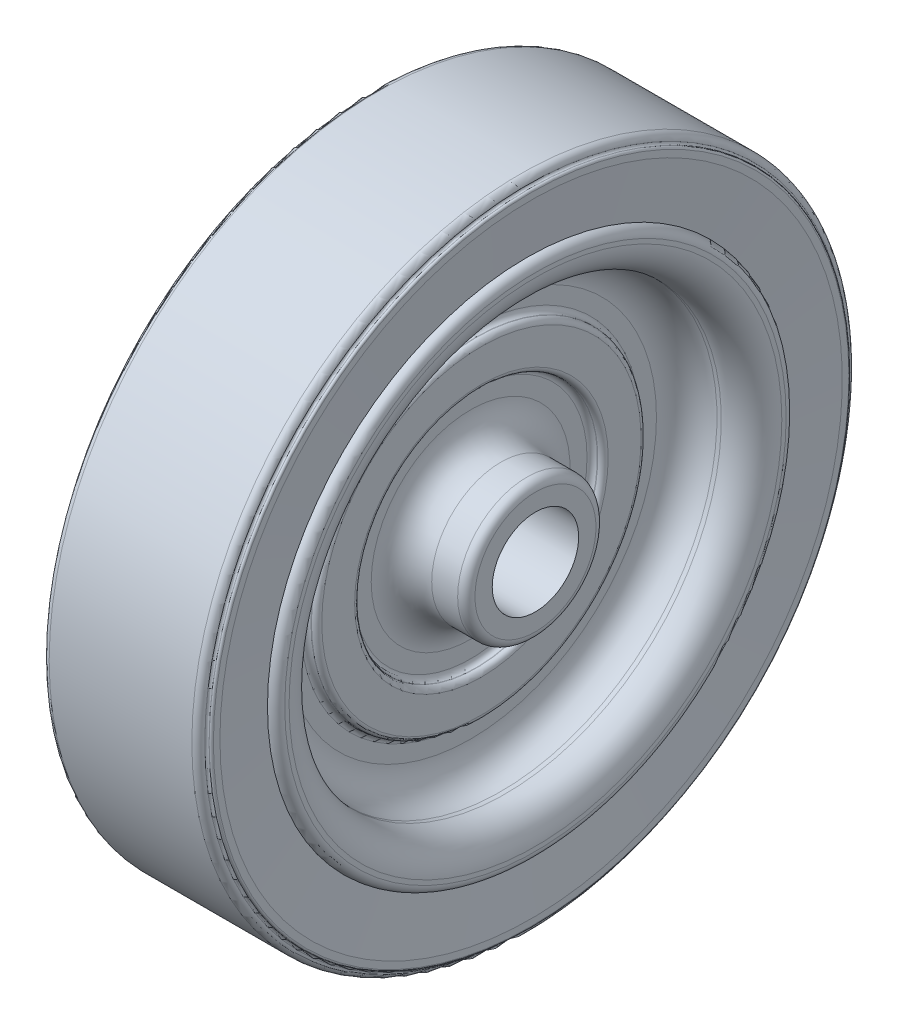
ISO-10303-21;
HEADER;
FILE_DESCRIPTION(('STEP AP214'),'2;1');
FILE_NAME('part.step','',(''),(''),'','','');
FILE_SCHEMA(('AUTOMOTIVE_DESIGN { 1 0 10303 214 1 1 1 1 }'));
ENDSEC;
DATA;
#1=APPLICATION_CONTEXT('core data for automotive mechanical design processes');
#2=APPLICATION_PROTOCOL_DEFINITION('international standard','automotive_design',2000,#1);
#3=PRODUCT_CONTEXT('',#1,'mechanical');
#4=PRODUCT('Part','Part','',(#3));
#5=PRODUCT_RELATED_PRODUCT_CATEGORY('part','',(#4));
#6=PRODUCT_DEFINITION_FORMATION('','',#4);
#7=PRODUCT_DEFINITION_CONTEXT('part definition',#1,'design');
#8=PRODUCT_DEFINITION('design','',#6,#7);
#9=PRODUCT_DEFINITION_SHAPE('','',#8);
#10=(LENGTH_UNIT() NAMED_UNIT(*) SI_UNIT(.MILLI.,.METRE.));
#11=(NAMED_UNIT(*) PLANE_ANGLE_UNIT() SI_UNIT($,.RADIAN.));
#12=(NAMED_UNIT(*) SI_UNIT($,.STERADIAN.) SOLID_ANGLE_UNIT());
#13=UNCERTAINTY_MEASURE_WITH_UNIT(LENGTH_MEASURE(1.E-05),#10,'distance_accuracy_value','');
#14=(GEOMETRIC_REPRESENTATION_CONTEXT(3) GLOBAL_UNCERTAINTY_ASSIGNED_CONTEXT((#13)) GLOBAL_UNIT_ASSIGNED_CONTEXT((#10,
#11,#12)) REPRESENTATION_CONTEXT('',''));
#15=CARTESIAN_POINT('',(0.,0.,0.));
#16=DIRECTION('',(0.,0.,1.));
#17=DIRECTION('',(1.,0.,0.));
#18=AXIS2_PLACEMENT_3D('',#15,#16,#17);
#19=CARTESIAN_POINT('',(18.7927608161497,14.,0.));
#20=DIRECTION('',(-1.,0.,0.));
#21=DIRECTION('',(0.,0.,1.));
#22=AXIS2_PLACEMENT_3D('',#19,#20,#21);
#23=PLANE('',#22);
#24=CARTESIAN_POINT('',(18.7927608161497,0.,0.));
#25=DIRECTION('',(-1.,0.,0.));
#26=DIRECTION('',(0.,0.,1.));
#27=AXIS2_PLACEMENT_3D('',#24,#25,#26);
#28=CIRCLE('',#27,14.);
#29=CARTESIAN_POINT('',(18.7927608161497,0.,14.));
#30=VERTEX_POINT('',#29);
#31=EDGE_CURVE('E10',#30,#30,#28,.T.);
#32=ORIENTED_EDGE('',*,*,#31,.F.);
#33=EDGE_LOOP('',(#32));
#34=FACE_BOUND('',#33,.T.);
#35=CARTESIAN_POINT('',(18.7927608161497,0.,0.));
#36=DIRECTION('',(-1.,0.,0.));
#37=DIRECTION('',(0.,0.,1.));
#38=AXIS2_PLACEMENT_3D('',#35,#36,#37);
#39=CIRCLE('',#38,10.);
#40=CARTESIAN_POINT('',(18.7927608161497,0.,10.));
#41=VERTEX_POINT('',#40);
#42=EDGE_CURVE('E147',#41,#41,#39,.T.);
#43=ORIENTED_EDGE('',*,*,#42,.T.);
#44=EDGE_LOOP('',(#43));
#45=FACE_BOUND('',#44,.T.);
#46=ADVANCED_FACE('F32',(#34,#45),#23,.F.);
#47=CARTESIAN_POINT('',(16.7927608161497,0.,0.));
#48=DIRECTION('',(-1.,0.,0.));
#49=DIRECTION('',(0.,0.,1.));
#50=AXIS2_PLACEMENT_3D('',#47,#48,#49);
#51=TOROIDAL_SURFACE('',#50,14.,2.);
#52=CARTESIAN_POINT('',(16.7927608161496,0.,0.));
#53=DIRECTION('',(-1.,0.,0.));
#54=DIRECTION('',(0.,0.,1.));
#55=AXIS2_PLACEMENT_3D('',#52,#53,#54);
#56=CIRCLE('',#55,16.);
#57=CARTESIAN_POINT('',(16.7927608161496,0.,16.));
#58=VERTEX_POINT('',#57);
#59=EDGE_CURVE('E38',#58,#58,#56,.T.);
#60=ORIENTED_EDGE('',*,*,#59,.F.);
#61=EDGE_LOOP('',(#60));
#62=FACE_BOUND('',#61,.T.);
#63=ORIENTED_EDGE('',*,*,#31,.T.);
#64=EDGE_LOOP('',(#63));
#65=FACE_BOUND('',#64,.T.);
#66=ADVANCED_FACE('F297',(#62,#65),#51,.T.);
#67=CARTESIAN_POINT('',(-29.5072725671877,0.,0.));
#68=DIRECTION('',(-1.,0.,0.));
#69=DIRECTION('',(0.,0.,1.));
#70=AXIS2_PLACEMENT_3D('',#67,#68,#69);
#71=CYLINDRICAL_SURFACE('',#70,16.);
#72=CARTESIAN_POINT('',(10.7927608161497,0.,0.));
#73=DIRECTION('',(-1.,0.,0.));
#74=DIRECTION('',(0.,0.,1.));
#75=AXIS2_PLACEMENT_3D('',#72,#73,#74);
#76=CIRCLE('',#75,16.);
#77=CARTESIAN_POINT('',(10.7927608161497,0.,16.));
#78=VERTEX_POINT('',#77);
#79=EDGE_CURVE('E42',#78,#78,#76,.T.);
#80=ORIENTED_EDGE('',*,*,#79,.F.);
#81=EDGE_LOOP('',(#80));
#82=FACE_BOUND('',#81,.T.);
#83=ORIENTED_EDGE('',*,*,#59,.T.);
#84=EDGE_LOOP('',(#83));
#85=FACE_BOUND('',#84,.T.);
#86=ADVANCED_FACE('F292',(#82,#85),#71,.T.);
#87=CARTESIAN_POINT('',(10.7927608161497,0.,0.));
#88=DIRECTION('',(-1.,0.,0.));
#89=DIRECTION('',(0.,0.,1.));
#90=AXIS2_PLACEMENT_3D('',#87,#88,#89);
#91=TOROIDAL_SURFACE('',#90,23.,7.);
#92=CARTESIAN_POINT('',(3.79276081614965,0.,0.));
#93=DIRECTION('',(-1.,0.,0.));
#94=DIRECTION('',(0.,0.,1.));
#95=AXIS2_PLACEMENT_3D('',#92,#93,#94);
#96=CIRCLE('',#95,23.);
#97=CARTESIAN_POINT('',(3.79276081614965,0.,23.));
#98=VERTEX_POINT('',#97);
#99=EDGE_CURVE('E46',#98,#98,#96,.T.);
#100=ORIENTED_EDGE('',*,*,#99,.F.);
#101=EDGE_LOOP('',(#100));
#102=FACE_BOUND('',#101,.T.);
#103=ORIENTED_EDGE('',*,*,#79,.T.);
#104=EDGE_LOOP('',(#103));
#105=FACE_BOUND('',#104,.T.);
#106=ADVANCED_FACE('F286',(#102,#105),#91,.F.);
#107=CARTESIAN_POINT('',(3.79276081614965,23.,0.));
#108=DIRECTION('',(-1.,0.,0.));
#109=DIRECTION('',(0.,0.,1.));
#110=AXIS2_PLACEMENT_3D('',#107,#108,#109);
#111=PLANE('',#110);
#112=CARTESIAN_POINT('',(3.79276081614965,0.,0.));
#113=DIRECTION('',(-1.,0.,0.));
#114=DIRECTION('',(0.,0.,1.));
#115=AXIS2_PLACEMENT_3D('',#112,#113,#114);
#116=CIRCLE('',#115,26.935922425169);
#117=CARTESIAN_POINT('',(3.79276081614965,0.,26.935922425169));
#118=VERTEX_POINT('',#117);
#119=EDGE_CURVE('E51',#118,#118,#116,.T.);
#120=ORIENTED_EDGE('',*,*,#119,.F.);
#121=EDGE_LOOP('',(#120));
#122=FACE_BOUND('',#121,.T.);
#123=ORIENTED_EDGE('',*,*,#99,.T.);
#124=EDGE_LOOP('',(#123));
#125=FACE_BOUND('',#124,.T.);
#126=ADVANCED_FACE('F280',(#122,#125),#111,.F.);
#127=CARTESIAN_POINT('',(4.99276081614965,0.,0.));
#128=DIRECTION('',(-1.,0.,0.));
#129=DIRECTION('',(0.,0.,1.));
#130=AXIS2_PLACEMENT_3D('',#127,#128,#129);
#131=TOROIDAL_SURFACE('',#130,26.935922425169,1.2);
#132=CARTESIAN_POINT('',(4.99276081614966,0.,0.));
#133=DIRECTION('',(-1.,0.,0.));
#134=DIRECTION('',(0.,0.,1.));
#135=AXIS2_PLACEMENT_3D('',#132,#133,#134);
#136=CIRCLE('',#135,28.135922425169);
#137=CARTESIAN_POINT('',(4.99276081614966,0.,28.135922425169));
#138=VERTEX_POINT('',#137);
#139=EDGE_CURVE('E54',#138,#138,#136,.T.);
#140=ORIENTED_EDGE('',*,*,#139,.F.);
#141=EDGE_LOOP('',(#140));
#142=FACE_BOUND('',#141,.T.);
#143=ORIENTED_EDGE('',*,*,#119,.T.);
#144=EDGE_LOOP('',(#143));
#145=FACE_BOUND('',#144,.T.);
#146=ADVANCED_FACE('F274',(#142,#145),#131,.F.);
#147=CARTESIAN_POINT('',(-29.5072725671877,0.,0.));
#148=DIRECTION('',(-1.,0.,0.));
#149=DIRECTION('',(0.,0.,1.));
#150=AXIS2_PLACEMENT_3D('',#147,#148,#149);
#151=CYLINDRICAL_SURFACE('',#150,28.135922425169);
#152=CARTESIAN_POINT('',(5.09276081614965,0.,0.));
#153=DIRECTION('',(-1.,0.,0.));
#154=DIRECTION('',(0.,0.,1.));
#155=AXIS2_PLACEMENT_3D('',#152,#153,#154);
#156=CIRCLE('',#155,28.135922425169);
#157=CARTESIAN_POINT('',(5.09276081614965,0.,28.135922425169));
#158=VERTEX_POINT('',#157);
#159=EDGE_CURVE('E57',#158,#158,#156,.T.);
#160=ORIENTED_EDGE('',*,*,#159,.F.);
#161=EDGE_LOOP('',(#160));
#162=FACE_BOUND('',#161,.T.);
#163=ORIENTED_EDGE('',*,*,#139,.T.);
#164=EDGE_LOOP('',(#163));
#165=FACE_BOUND('',#164,.T.);
#166=ADVANCED_FACE('F268',(#162,#165),#151,.F.);
#167=CARTESIAN_POINT('',(5.09276081614966,0.,0.));
#168=DIRECTION('',(-1.,0.,0.));
#169=DIRECTION('',(0.,0.,1.));
#170=AXIS2_PLACEMENT_3D('',#167,#168,#169);
#171=TOROIDAL_SURFACE('',#170,29.335922425169,1.2);
#172=CARTESIAN_POINT('',(6.29276081614966,0.,0.));
#173=DIRECTION('',(-1.,0.,0.));
#174=DIRECTION('',(0.,0.,1.));
#175=AXIS2_PLACEMENT_3D('',#172,#173,#174);
#176=CIRCLE('',#175,29.335922425169);
#177=CARTESIAN_POINT('',(6.29276081614966,0.,29.335922425169));
#178=VERTEX_POINT('',#177);
#179=EDGE_CURVE('E60',#178,#178,#176,.T.);
#180=ORIENTED_EDGE('',*,*,#179,.F.);
#181=EDGE_LOOP('',(#180));
#182=FACE_BOUND('',#181,.T.);
#183=ORIENTED_EDGE('',*,*,#159,.T.);
#184=EDGE_LOOP('',(#183));
#185=FACE_BOUND('',#184,.T.);
#186=ADVANCED_FACE('F262',(#182,#185),#171,.T.);
#187=CARTESIAN_POINT('',(6.29276081614966,36.935922425169,0.));
#188=DIRECTION('',(-1.,0.,0.));
#189=DIRECTION('',(0.,0.,1.));
#190=AXIS2_PLACEMENT_3D('',#187,#188,#189);
#191=PLANE('',#190);
#192=CARTESIAN_POINT('',(6.29276081614966,0.,0.));
#193=DIRECTION('',(-1.,0.,0.));
#194=DIRECTION('',(0.,0.,1.));
#195=AXIS2_PLACEMENT_3D('',#192,#193,#194);
#196=CIRCLE('',#195,36.935922425169);
#197=CARTESIAN_POINT('',(6.29276081614966,0.,36.935922425169));
#198=VERTEX_POINT('',#197);
#199=EDGE_CURVE('E63',#198,#198,#196,.T.);
#200=ORIENTED_EDGE('',*,*,#199,.F.);
#201=EDGE_LOOP('',(#200));
#202=FACE_BOUND('',#201,.T.);
#203=ORIENTED_EDGE('',*,*,#179,.T.);
#204=EDGE_LOOP('',(#203));
#205=FACE_BOUND('',#204,.T.);
#206=ADVANCED_FACE('F256',(#202,#205),#191,.F.);
#207=CARTESIAN_POINT('',(5.09276081614966,0.,0.));
#208=DIRECTION('',(-1.,0.,0.));
#209=DIRECTION('',(0.,0.,1.));
#210=AXIS2_PLACEMENT_3D('',#207,#208,#209);
#211=TOROIDAL_SURFACE('',#210,36.935922425169,1.2);
#212=CARTESIAN_POINT('',(5.09276081614965,0.,0.));
#213=DIRECTION('',(-1.,0.,0.));
#214=DIRECTION('',(0.,0.,1.));
#215=AXIS2_PLACEMENT_3D('',#212,#213,#214);
#216=CIRCLE('',#215,38.135922425169);
#217=CARTESIAN_POINT('',(5.09276081614965,0.,38.135922425169));
#218=VERTEX_POINT('',#217);
#219=EDGE_CURVE('E66',#218,#218,#216,.T.);
#220=ORIENTED_EDGE('',*,*,#219,.F.);
#221=EDGE_LOOP('',(#220));
#222=FACE_BOUND('',#221,.T.);
#223=ORIENTED_EDGE('',*,*,#199,.T.);
#224=EDGE_LOOP('',(#223));
#225=FACE_BOUND('',#224,.T.);
#226=ADVANCED_FACE('F250',(#222,#225),#211,.T.);
#227=CARTESIAN_POINT('',(-29.5072725671877,0.,0.));
#228=DIRECTION('',(-1.,0.,0.));
#229=DIRECTION('',(0.,0.,1.));
#230=AXIS2_PLACEMENT_3D('',#227,#228,#229);
#231=CYLINDRICAL_SURFACE('',#230,38.135922425169);
#232=CARTESIAN_POINT('',(4.99276081614966,0.,0.));
#233=DIRECTION('',(-1.,0.,0.));
#234=DIRECTION('',(0.,0.,1.));
#235=AXIS2_PLACEMENT_3D('',#232,#233,#234);
#236=CIRCLE('',#235,38.135922425169);
#237=CARTESIAN_POINT('',(4.99276081614966,0.,38.135922425169));
#238=VERTEX_POINT('',#237);
#239=EDGE_CURVE('E69',#238,#238,#236,.T.);
#240=ORIENTED_EDGE('',*,*,#239,.F.);
#241=EDGE_LOOP('',(#240));
#242=FACE_BOUND('',#241,.T.);
#243=ORIENTED_EDGE('',*,*,#219,.T.);
#244=EDGE_LOOP('',(#243));
#245=FACE_BOUND('',#244,.T.);
#246=ADVANCED_FACE('F244',(#242,#245),#231,.T.);
#247=CARTESIAN_POINT('',(4.99276081614965,0.,0.));
#248=DIRECTION('',(-1.,0.,0.));
#249=DIRECTION('',(0.,0.,1.));
#250=AXIS2_PLACEMENT_3D('',#247,#248,#249);
#251=TOROIDAL_SURFACE('',#250,39.335922425169,1.2);
#252=CARTESIAN_POINT('',(3.79276081614965,0.,0.));
#253=DIRECTION('',(-1.,0.,0.));
#254=DIRECTION('',(0.,0.,1.));
#255=AXIS2_PLACEMENT_3D('',#252,#253,#254);
#256=CIRCLE('',#255,39.335922425169);
#257=CARTESIAN_POINT('',(3.79276081614965,0.,39.335922425169));
#258=VERTEX_POINT('',#257);
#259=EDGE_CURVE('E72',#258,#258,#256,.T.);
#260=ORIENTED_EDGE('',*,*,#259,.F.);
#261=EDGE_LOOP('',(#260));
#262=FACE_BOUND('',#261,.T.);
#263=ORIENTED_EDGE('',*,*,#239,.T.);
#264=EDGE_LOOP('',(#263));
#265=FACE_BOUND('',#264,.T.);
#266=ADVANCED_FACE('F238',(#262,#265),#251,.F.);
#267=CARTESIAN_POINT('',(3.79276081614965,39.335922425169,0.));
#268=DIRECTION('',(-1.,0.,0.));
#269=DIRECTION('',(0.,0.,1.));
#270=AXIS2_PLACEMENT_3D('',#267,#268,#269);
#271=PLANE('',#270);
#272=CARTESIAN_POINT('',(3.79276081614965,0.,0.));
#273=DIRECTION('',(-1.,0.,0.));
#274=DIRECTION('',(0.,0.,1.));
#275=AXIS2_PLACEMENT_3D('',#272,#273,#274);
#276=CIRCLE('',#275,43.);
#277=CARTESIAN_POINT('',(3.79276081614965,0.,43.));
#278=VERTEX_POINT('',#277);
#279=EDGE_CURVE('E75',#278,#278,#276,.T.);
#280=ORIENTED_EDGE('',*,*,#279,.F.);
#281=EDGE_LOOP('',(#280));
#282=FACE_BOUND('',#281,.T.);
#283=ORIENTED_EDGE('',*,*,#259,.T.);
#284=EDGE_LOOP('',(#283));
#285=FACE_BOUND('',#284,.T.);
#286=ADVANCED_FACE('F232',(#282,#285),#271,.F.);
#287=CARTESIAN_POINT('',(10.7927608161497,0.,0.));
#288=DIRECTION('',(-1.,0.,0.));
#289=DIRECTION('',(0.,0.,1.));
#290=AXIS2_PLACEMENT_3D('',#287,#288,#289);
#291=TOROIDAL_SURFACE('',#290,43.,7.);
#292=CARTESIAN_POINT('',(10.7927608161497,0.,0.));
#293=DIRECTION('',(-1.,0.,0.));
#294=DIRECTION('',(0.,0.,1.));
#295=AXIS2_PLACEMENT_3D('',#292,#293,#294);
#296=CIRCLE('',#295,50.);
#297=CARTESIAN_POINT('',(10.7927608161497,0.,50.));
#298=VERTEX_POINT('',#297);
#299=EDGE_CURVE('E78',#298,#298,#296,.T.);
#300=ORIENTED_EDGE('',*,*,#299,.F.);
#301=EDGE_LOOP('',(#300));
#302=FACE_BOUND('',#301,.T.);
#303=ORIENTED_EDGE('',*,*,#279,.T.);
#304=EDGE_LOOP('',(#303));
#305=FACE_BOUND('',#304,.T.);
#306=ADVANCED_FACE('F226',(#302,#305),#291,.F.);
#307=CARTESIAN_POINT('',(-29.5072725671877,0.,0.));
#308=DIRECTION('',(-1.,0.,0.));
#309=DIRECTION('',(0.,0.,1.));
#310=AXIS2_PLACEMENT_3D('',#307,#308,#309);
#311=CYLINDRICAL_SURFACE('',#310,50.);
#312=CARTESIAN_POINT('',(11.7927608161496,0.,0.));
#313=DIRECTION('',(-1.,0.,0.));
#314=DIRECTION('',(0.,0.,1.));
#315=AXIS2_PLACEMENT_3D('',#312,#313,#314);
#316=CIRCLE('',#315,50.);
#317=CARTESIAN_POINT('',(11.7927608161496,0.,50.));
#318=VERTEX_POINT('',#317);
#319=EDGE_CURVE('E81',#318,#318,#316,.T.);
#320=ORIENTED_EDGE('',*,*,#319,.F.);
#321=EDGE_LOOP('',(#320));
#322=FACE_BOUND('',#321,.T.);
#323=ORIENTED_EDGE('',*,*,#299,.T.);
#324=EDGE_LOOP('',(#323));
#325=FACE_BOUND('',#324,.T.);
#326=ADVANCED_FACE('F220',(#322,#325),#311,.F.);
#327=CARTESIAN_POINT('',(11.7927608161497,0.,0.));
#328=DIRECTION('',(-1.,0.,0.));
#329=DIRECTION('',(0.,0.,1.));
#330=AXIS2_PLACEMENT_3D('',#327,#328,#329);
#331=TOROIDAL_SURFACE('',#330,57.,7.);
#332=CARTESIAN_POINT('',(18.7927608161497,0.,0.));
#333=DIRECTION('',(-1.,0.,0.));
#334=DIRECTION('',(0.,0.,1.));
#335=AXIS2_PLACEMENT_3D('',#332,#333,#334);
#336=CIRCLE('',#335,57.);
#337=CARTESIAN_POINT('',(18.7927608161497,0.,57.));
#338=VERTEX_POINT('',#337);
#339=EDGE_CURVE('E84',#338,#338,#336,.T.);
#340=ORIENTED_EDGE('',*,*,#339,.F.);
#341=EDGE_LOOP('',(#340));
#342=FACE_BOUND('',#341,.T.);
#343=ORIENTED_EDGE('',*,*,#319,.T.);
#344=EDGE_LOOP('',(#343));
#345=FACE_BOUND('',#344,.T.);
#346=ADVANCED_FACE('F214',(#342,#345),#331,.T.);
#347=CARTESIAN_POINT('',(18.7927608161497,57.,0.));
#348=DIRECTION('',(-1.,0.,0.));
#349=DIRECTION('',(0.,0.,1.));
#350=AXIS2_PLACEMENT_3D('',#347,#348,#349);
#351=PLANE('',#350);
#352=CARTESIAN_POINT('',(18.7927608161497,0.,0.));
#353=DIRECTION('',(-1.,0.,0.));
#354=DIRECTION('',(0.,0.,1.));
#355=AXIS2_PLACEMENT_3D('',#352,#353,#354);
#356=CIRCLE('',#355,58.);
#357=CARTESIAN_POINT('',(18.7927608161497,0.,58.));
#358=VERTEX_POINT('',#357);
#359=EDGE_CURVE('E87',#358,#358,#356,.T.);
#360=ORIENTED_EDGE('',*,*,#359,.F.);
#361=EDGE_LOOP('',(#360));
#362=FACE_BOUND('',#361,.T.);
#363=ORIENTED_EDGE('',*,*,#339,.T.);
#364=EDGE_LOOP('',(#363));
#365=FACE_BOUND('',#364,.T.);
#366=ADVANCED_FACE('F208',(#362,#365),#351,.F.);
#367=CARTESIAN_POINT('',(16.7927608161497,0.,0.));
#368=DIRECTION('',(-1.,0.,0.));
#369=DIRECTION('',(0.,0.,1.));
#370=AXIS2_PLACEMENT_3D('',#367,#368,#369);
#371=TOROIDAL_SURFACE('',#370,58.,2.);
#372=CARTESIAN_POINT('',(16.7927608161497,0.,0.));
#373=DIRECTION('',(-1.,0.,0.));
#374=DIRECTION('',(0.,0.,1.));
#375=AXIS2_PLACEMENT_3D('',#372,#373,#374);
#376=CIRCLE('',#375,60.);
#377=CARTESIAN_POINT('',(16.7927608161497,0.,60.));
#378=VERTEX_POINT('',#377);
#379=EDGE_CURVE('E90',#378,#378,#376,.T.);
#380=ORIENTED_EDGE('',*,*,#379,.F.);
#381=EDGE_LOOP('',(#380));
#382=FACE_BOUND('',#381,.T.);
#383=ORIENTED_EDGE('',*,*,#359,.T.);
#384=EDGE_LOOP('',(#383));
#385=FACE_BOUND('',#384,.T.);
#386=ADVANCED_FACE('F204',(#382,#385),#371,.T.);
#387=CARTESIAN_POINT('',(-19.2072391838503,0.,0.));
#388=DIRECTION('',(-1.,0.,0.));
#389=DIRECTION('',(0.,0.,1.));
#390=AXIS2_PLACEMENT_3D('',#387,#388,#389);
#391=TOROIDAL_SURFACE('',#390,58.,2.);
#392=CARTESIAN_POINT('',(-21.2072391838503,0.,0.));
#393=DIRECTION('',(-1.,0.,0.));
#394=DIRECTION('',(0.,0.,1.));
#395=AXIS2_PLACEMENT_3D('',#392,#393,#394);
#396=CIRCLE('',#395,58.);
#397=CARTESIAN_POINT('',(-21.2072391838503,0.,58.));
#398=VERTEX_POINT('',#397);
#399=EDGE_CURVE('E93',#398,#398,#396,.T.);
#400=ORIENTED_EDGE('',*,*,#399,.F.);
#401=EDGE_LOOP('',(#400));
#402=FACE_BOUND('',#401,.T.);
#403=CARTESIAN_POINT('',(-19.2072391838503,0.,0.));
#404=DIRECTION('',(-1.,0.,0.));
#405=DIRECTION('',(0.,0.,1.));
#406=AXIS2_PLACEMENT_3D('',#403,#404,#405);
#407=CIRCLE('',#406,60.);
#408=CARTESIAN_POINT('',(-19.2072391838503,0.,60.));
#409=VERTEX_POINT('',#408);
#410=EDGE_CURVE('E150',#409,#409,#407,.T.);
#411=ORIENTED_EDGE('',*,*,#410,.T.);
#412=EDGE_LOOP('',(#411));
#413=FACE_BOUND('',#412,.T.);
#414=ADVANCED_FACE('F207',(#402,#413),#391,.T.);
#415=CARTESIAN_POINT('',(-21.2072391838503,57.,0.));
#416=DIRECTION('',(1.,0.,0.));
#417=DIRECTION('',(0.,0.,-1.));
#418=AXIS2_PLACEMENT_3D('',#415,#416,#417);
#419=PLANE('',#418);
#420=CARTESIAN_POINT('',(-21.2072391838503,0.,0.));
#421=DIRECTION('',(-1.,0.,0.));
#422=DIRECTION('',(0.,0.,1.));
#423=AXIS2_PLACEMENT_3D('',#420,#421,#422);
#424=CIRCLE('',#423,57.);
#425=CARTESIAN_POINT('',(-21.2072391838503,0.,57.));
#426=VERTEX_POINT('',#425);
#427=EDGE_CURVE('E96',#426,#426,#424,.T.);
#428=ORIENTED_EDGE('',*,*,#427,.F.);
#429=EDGE_LOOP('',(#428));
#430=FACE_BOUND('',#429,.T.);
#431=ORIENTED_EDGE('',*,*,#399,.T.);
#432=EDGE_LOOP('',(#431));
#433=FACE_BOUND('',#432,.T.);
#434=ADVANCED_FACE('F410',(#430,#433),#419,.F.);
#435=CARTESIAN_POINT('',(-14.2072391838503,0.,0.));
#436=DIRECTION('',(-1.,0.,0.));
#437=DIRECTION('',(0.,0.,1.));
#438=AXIS2_PLACEMENT_3D('',#435,#436,#437);
#439=TOROIDAL_SURFACE('',#438,57.,7.);
#440=CARTESIAN_POINT('',(-14.2072391838503,0.,0.));
#441=DIRECTION('',(-1.,0.,0.));
#442=DIRECTION('',(0.,0.,1.));
#443=AXIS2_PLACEMENT_3D('',#440,#441,#442);
#444=CIRCLE('',#443,50.);
#445=CARTESIAN_POINT('',(-14.2072391838503,0.,50.));
#446=VERTEX_POINT('',#445);
#447=EDGE_CURVE('E99',#446,#446,#444,.T.);
#448=ORIENTED_EDGE('',*,*,#447,.F.);
#449=EDGE_LOOP('',(#448));
#450=FACE_BOUND('',#449,.T.);
#451=ORIENTED_EDGE('',*,*,#427,.T.);
#452=EDGE_LOOP('',(#451));
#453=FACE_BOUND('',#452,.T.);
#454=ADVANCED_FACE('F404',(#450,#453),#439,.T.);
#455=CARTESIAN_POINT('',(-29.5072725671877,0.,0.));
#456=DIRECTION('',(-1.,0.,0.));
#457=DIRECTION('',(0.,0.,1.));
#458=AXIS2_PLACEMENT_3D('',#455,#456,#457);
#459=CYLINDRICAL_SURFACE('',#458,50.);
#460=CARTESIAN_POINT('',(-13.2072391838504,0.,0.));
#461=DIRECTION('',(-1.,0.,0.));
#462=DIRECTION('',(0.,0.,1.));
#463=AXIS2_PLACEMENT_3D('',#460,#461,#462);
#464=CIRCLE('',#463,50.);
#465=CARTESIAN_POINT('',(-13.2072391838504,0.,50.));
#466=VERTEX_POINT('',#465);
#467=EDGE_CURVE('E102',#466,#466,#464,.T.);
#468=ORIENTED_EDGE('',*,*,#467,.F.);
#469=EDGE_LOOP('',(#468));
#470=FACE_BOUND('',#469,.T.);
#471=ORIENTED_EDGE('',*,*,#447,.T.);
#472=EDGE_LOOP('',(#471));
#473=FACE_BOUND('',#472,.T.);
#474=ADVANCED_FACE('F398',(#470,#473),#459,.F.);
#475=CARTESIAN_POINT('',(-13.2072391838503,0.,0.));
#476=DIRECTION('',(-1.,0.,0.));
#477=DIRECTION('',(0.,0.,1.));
#478=AXIS2_PLACEMENT_3D('',#475,#476,#477);
#479=TOROIDAL_SURFACE('',#478,43.,7.);
#480=CARTESIAN_POINT('',(-6.20723918385035,0.,0.));
#481=DIRECTION('',(-1.,0.,0.));
#482=DIRECTION('',(0.,0.,1.));
#483=AXIS2_PLACEMENT_3D('',#480,#481,#482);
#484=CIRCLE('',#483,43.);
#485=CARTESIAN_POINT('',(-6.20723918385035,0.,43.));
#486=VERTEX_POINT('',#485);
#487=EDGE_CURVE('E105',#486,#486,#484,.T.);
#488=ORIENTED_EDGE('',*,*,#487,.F.);
#489=EDGE_LOOP('',(#488));
#490=FACE_BOUND('',#489,.T.);
#491=ORIENTED_EDGE('',*,*,#467,.T.);
#492=EDGE_LOOP('',(#491));
#493=FACE_BOUND('',#492,.T.);
#494=ADVANCED_FACE('F392',(#490,#493),#479,.F.);
#495=CARTESIAN_POINT('',(-6.20723918385035,39.335922425169,0.));
#496=DIRECTION('',(1.,0.,0.));
#497=DIRECTION('',(0.,0.,-1.));
#498=AXIS2_PLACEMENT_3D('',#495,#496,#497);
#499=PLANE('',#498);
#500=CARTESIAN_POINT('',(-6.20723918385035,0.,0.));
#501=DIRECTION('',(-1.,0.,0.));
#502=DIRECTION('',(0.,0.,1.));
#503=AXIS2_PLACEMENT_3D('',#500,#501,#502);
#504=CIRCLE('',#503,39.335922425169);
#505=CARTESIAN_POINT('',(-6.20723918385035,0.,39.335922425169));
#506=VERTEX_POINT('',#505);
#507=EDGE_CURVE('E108',#506,#506,#504,.T.);
#508=ORIENTED_EDGE('',*,*,#507,.F.);
#509=EDGE_LOOP('',(#508));
#510=FACE_BOUND('',#509,.T.);
#511=ORIENTED_EDGE('',*,*,#487,.T.);
#512=EDGE_LOOP('',(#511));
#513=FACE_BOUND('',#512,.T.);
#514=ADVANCED_FACE('F386',(#510,#513),#499,.F.);
#515=CARTESIAN_POINT('',(-7.40723918385035,0.,0.));
#516=DIRECTION('',(-1.,0.,0.));
#517=DIRECTION('',(0.,0.,1.));
#518=AXIS2_PLACEMENT_3D('',#515,#516,#517);
#519=TOROIDAL_SURFACE('',#518,39.335922425169,1.2);
#520=CARTESIAN_POINT('',(-7.40723918385035,0.,0.));
#521=DIRECTION('',(-1.,0.,0.));
#522=DIRECTION('',(0.,0.,1.));
#523=AXIS2_PLACEMENT_3D('',#520,#521,#522);
#524=CIRCLE('',#523,38.135922425169);
#525=CARTESIAN_POINT('',(-7.40723918385035,0.,38.135922425169));
#526=VERTEX_POINT('',#525);
#527=EDGE_CURVE('E111',#526,#526,#524,.T.);
#528=ORIENTED_EDGE('',*,*,#527,.F.);
#529=EDGE_LOOP('',(#528));
#530=FACE_BOUND('',#529,.T.);
#531=ORIENTED_EDGE('',*,*,#507,.T.);
#532=EDGE_LOOP('',(#531));
#533=FACE_BOUND('',#532,.T.);
#534=ADVANCED_FACE('F380',(#530,#533),#519,.F.);
#535=CARTESIAN_POINT('',(-29.5072725671877,0.,0.));
#536=DIRECTION('',(-1.,0.,0.));
#537=DIRECTION('',(0.,0.,1.));
#538=AXIS2_PLACEMENT_3D('',#535,#536,#537);
#539=CYLINDRICAL_SURFACE('',#538,38.135922425169);
#540=CARTESIAN_POINT('',(-7.50723918385034,0.,0.));
#541=DIRECTION('',(-1.,0.,0.));
#542=DIRECTION('',(0.,0.,1.));
#543=AXIS2_PLACEMENT_3D('',#540,#541,#542);
#544=CIRCLE('',#543,38.135922425169);
#545=CARTESIAN_POINT('',(-7.50723918385034,0.,38.135922425169));
#546=VERTEX_POINT('',#545);
#547=EDGE_CURVE('E114',#546,#546,#544,.T.);
#548=ORIENTED_EDGE('',*,*,#547,.F.);
#549=EDGE_LOOP('',(#548));
#550=FACE_BOUND('',#549,.T.);
#551=ORIENTED_EDGE('',*,*,#527,.T.);
#552=EDGE_LOOP('',(#551));
#553=FACE_BOUND('',#552,.T.);
#554=ADVANCED_FACE('F374',(#550,#553),#539,.T.);
#555=CARTESIAN_POINT('',(-7.50723918385034,0.,0.));
#556=DIRECTION('',(-1.,0.,0.));
#557=DIRECTION('',(0.,0.,1.));
#558=AXIS2_PLACEMENT_3D('',#555,#556,#557);
#559=TOROIDAL_SURFACE('',#558,36.935922425169,1.2);
#560=CARTESIAN_POINT('',(-8.70723918385034,0.,0.));
#561=DIRECTION('',(-1.,0.,0.));
#562=DIRECTION('',(0.,0.,1.));
#563=AXIS2_PLACEMENT_3D('',#560,#561,#562);
#564=CIRCLE('',#563,36.935922425169);
#565=CARTESIAN_POINT('',(-8.70723918385034,0.,36.935922425169));
#566=VERTEX_POINT('',#565);
#567=EDGE_CURVE('E117',#566,#566,#564,.T.);
#568=ORIENTED_EDGE('',*,*,#567,.F.);
#569=EDGE_LOOP('',(#568));
#570=FACE_BOUND('',#569,.T.);
#571=ORIENTED_EDGE('',*,*,#547,.T.);
#572=EDGE_LOOP('',(#571));
#573=FACE_BOUND('',#572,.T.);
#574=ADVANCED_FACE('F368',(#570,#573),#559,.T.);
#575=CARTESIAN_POINT('',(-8.70723918385034,36.935922425169,0.));
#576=DIRECTION('',(1.,0.,0.));
#577=DIRECTION('',(0.,0.,-1.));
#578=AXIS2_PLACEMENT_3D('',#575,#576,#577);
#579=PLANE('',#578);
#580=CARTESIAN_POINT('',(-8.70723918385034,0.,0.));
#581=DIRECTION('',(-1.,0.,0.));
#582=DIRECTION('',(0.,0.,1.));
#583=AXIS2_PLACEMENT_3D('',#580,#581,#582);
#584=CIRCLE('',#583,29.335922425169);
#585=CARTESIAN_POINT('',(-8.70723918385034,0.,29.335922425169));
#586=VERTEX_POINT('',#585);
#587=EDGE_CURVE('E120',#586,#586,#584,.T.);
#588=ORIENTED_EDGE('',*,*,#587,.F.);
#589=EDGE_LOOP('',(#588));
#590=FACE_BOUND('',#589,.T.);
#591=ORIENTED_EDGE('',*,*,#567,.T.);
#592=EDGE_LOOP('',(#591));
#593=FACE_BOUND('',#592,.T.);
#594=ADVANCED_FACE('F362',(#590,#593),#579,.F.);
#595=CARTESIAN_POINT('',(-7.50723918385034,0.,0.));
#596=DIRECTION('',(-1.,0.,0.));
#597=DIRECTION('',(0.,0.,1.));
#598=AXIS2_PLACEMENT_3D('',#595,#596,#597);
#599=TOROIDAL_SURFACE('',#598,29.335922425169,1.2);
#600=CARTESIAN_POINT('',(-7.50723918385033,0.,0.));
#601=DIRECTION('',(-1.,0.,0.));
#602=DIRECTION('',(0.,0.,1.));
#603=AXIS2_PLACEMENT_3D('',#600,#601,#602);
#604=CIRCLE('',#603,28.135922425169);
#605=CARTESIAN_POINT('',(-7.50723918385033,0.,28.135922425169));
#606=VERTEX_POINT('',#605);
#607=EDGE_CURVE('E123',#606,#606,#604,.T.);
#608=ORIENTED_EDGE('',*,*,#607,.F.);
#609=EDGE_LOOP('',(#608));
#610=FACE_BOUND('',#609,.T.);
#611=ORIENTED_EDGE('',*,*,#587,.T.);
#612=EDGE_LOOP('',(#611));
#613=FACE_BOUND('',#612,.T.);
#614=ADVANCED_FACE('F356',(#610,#613),#599,.T.);
#615=CARTESIAN_POINT('',(-29.5072725671877,0.,0.));
#616=DIRECTION('',(-1.,0.,0.));
#617=DIRECTION('',(0.,0.,1.));
#618=AXIS2_PLACEMENT_3D('',#615,#616,#617);
#619=CYLINDRICAL_SURFACE('',#618,28.135922425169);
#620=CARTESIAN_POINT('',(-7.40723918385035,0.,0.));
#621=DIRECTION('',(-1.,0.,0.));
#622=DIRECTION('',(0.,0.,1.));
#623=AXIS2_PLACEMENT_3D('',#620,#621,#622);
#624=CIRCLE('',#623,28.135922425169);
#625=CARTESIAN_POINT('',(-7.40723918385035,0.,28.135922425169));
#626=VERTEX_POINT('',#625);
#627=EDGE_CURVE('E126',#626,#626,#624,.T.);
#628=ORIENTED_EDGE('',*,*,#627,.F.);
#629=EDGE_LOOP('',(#628));
#630=FACE_BOUND('',#629,.T.);
#631=ORIENTED_EDGE('',*,*,#607,.T.);
#632=EDGE_LOOP('',(#631));
#633=FACE_BOUND('',#632,.T.);
#634=ADVANCED_FACE('F350',(#630,#633),#619,.F.);
#635=CARTESIAN_POINT('',(-7.40723918385035,0.,0.));
#636=DIRECTION('',(-1.,0.,0.));
#637=DIRECTION('',(0.,0.,1.));
#638=AXIS2_PLACEMENT_3D('',#635,#636,#637);
#639=TOROIDAL_SURFACE('',#638,26.935922425169,1.2);
#640=CARTESIAN_POINT('',(-6.20723918385035,0.,0.));
#641=DIRECTION('',(-1.,0.,0.));
#642=DIRECTION('',(0.,0.,1.));
#643=AXIS2_PLACEMENT_3D('',#640,#641,#642);
#644=CIRCLE('',#643,26.935922425169);
#645=CARTESIAN_POINT('',(-6.20723918385035,0.,26.935922425169));
#646=VERTEX_POINT('',#645);
#647=EDGE_CURVE('E129',#646,#646,#644,.T.);
#648=ORIENTED_EDGE('',*,*,#647,.F.);
#649=EDGE_LOOP('',(#648));
#650=FACE_BOUND('',#649,.T.);
#651=ORIENTED_EDGE('',*,*,#627,.T.);
#652=EDGE_LOOP('',(#651));
#653=FACE_BOUND('',#652,.T.);
#654=ADVANCED_FACE('F344',(#650,#653),#639,.F.);
#655=CARTESIAN_POINT('',(-6.20723918385035,23.,0.));
#656=DIRECTION('',(1.,0.,0.));
#657=DIRECTION('',(0.,0.,-1.));
#658=AXIS2_PLACEMENT_3D('',#655,#656,#657);
#659=PLANE('',#658);
#660=CARTESIAN_POINT('',(-6.20723918385035,0.,0.));
#661=DIRECTION('',(-1.,0.,0.));
#662=DIRECTION('',(0.,0.,1.));
#663=AXIS2_PLACEMENT_3D('',#660,#661,#662);
#664=CIRCLE('',#663,23.);
#665=CARTESIAN_POINT('',(-6.20723918385035,0.,23.));
#666=VERTEX_POINT('',#665);
#667=EDGE_CURVE('E132',#666,#666,#664,.T.);
#668=ORIENTED_EDGE('',*,*,#667,.F.);
#669=EDGE_LOOP('',(#668));
#670=FACE_BOUND('',#669,.T.);
#671=ORIENTED_EDGE('',*,*,#647,.T.);
#672=EDGE_LOOP('',(#671));
#673=FACE_BOUND('',#672,.T.);
#674=ADVANCED_FACE('F338',(#670,#673),#659,.F.);
#675=CARTESIAN_POINT('',(-13.2072391838503,0.,0.));
#676=DIRECTION('',(-1.,0.,0.));
#677=DIRECTION('',(0.,0.,1.));
#678=AXIS2_PLACEMENT_3D('',#675,#676,#677);
#679=TOROIDAL_SURFACE('',#678,23.,7.);
#680=CARTESIAN_POINT('',(-13.2072391838504,0.,0.));
#681=DIRECTION('',(-1.,0.,0.));
#682=DIRECTION('',(0.,0.,1.));
#683=AXIS2_PLACEMENT_3D('',#680,#681,#682);
#684=CIRCLE('',#683,16.);
#685=CARTESIAN_POINT('',(-13.2072391838504,0.,16.));
#686=VERTEX_POINT('',#685);
#687=EDGE_CURVE('E135',#686,#686,#684,.T.);
#688=ORIENTED_EDGE('',*,*,#687,.F.);
#689=EDGE_LOOP('',(#688));
#690=FACE_BOUND('',#689,.T.);
#691=ORIENTED_EDGE('',*,*,#667,.T.);
#692=EDGE_LOOP('',(#691));
#693=FACE_BOUND('',#692,.T.);
#694=ADVANCED_FACE('F332',(#690,#693),#679,.F.);
#695=CARTESIAN_POINT('',(-29.5072725671877,0.,0.));
#696=DIRECTION('',(-1.,0.,0.));
#697=DIRECTION('',(0.,0.,1.));
#698=AXIS2_PLACEMENT_3D('',#695,#696,#697);
#699=CYLINDRICAL_SURFACE('',#698,16.);
#700=CARTESIAN_POINT('',(-19.2072391838503,0.,0.));
#701=DIRECTION('',(-1.,0.,0.));
#702=DIRECTION('',(0.,0.,1.));
#703=AXIS2_PLACEMENT_3D('',#700,#701,#702);
#704=CIRCLE('',#703,16.);
#705=CARTESIAN_POINT('',(-19.2072391838503,0.,16.));
#706=VERTEX_POINT('',#705);
#707=EDGE_CURVE('E138',#706,#706,#704,.T.);
#708=ORIENTED_EDGE('',*,*,#707,.F.);
#709=EDGE_LOOP('',(#708));
#710=FACE_BOUND('',#709,.T.);
#711=ORIENTED_EDGE('',*,*,#687,.T.);
#712=EDGE_LOOP('',(#711));
#713=FACE_BOUND('',#712,.T.);
#714=ADVANCED_FACE('F326',(#710,#713),#699,.T.);
#715=CARTESIAN_POINT('',(-19.2072391838503,0.,0.));
#716=DIRECTION('',(-1.,0.,0.));
#717=DIRECTION('',(0.,0.,1.));
#718=AXIS2_PLACEMENT_3D('',#715,#716,#717);
#719=TOROIDAL_SURFACE('',#718,14.,2.);
#720=CARTESIAN_POINT('',(-21.2072391838503,0.,0.));
#721=DIRECTION('',(-1.,0.,0.));
#722=DIRECTION('',(0.,0.,1.));
#723=AXIS2_PLACEMENT_3D('',#720,#721,#722);
#724=CIRCLE('',#723,14.);
#725=CARTESIAN_POINT('',(-21.2072391838503,0.,14.));
#726=VERTEX_POINT('',#725);
#727=EDGE_CURVE('E141',#726,#726,#724,.T.);
#728=ORIENTED_EDGE('',*,*,#727,.F.);
#729=EDGE_LOOP('',(#728));
#730=FACE_BOUND('',#729,.T.);
#731=ORIENTED_EDGE('',*,*,#707,.T.);
#732=EDGE_LOOP('',(#731));
#733=FACE_BOUND('',#732,.T.);
#734=ADVANCED_FACE('F320',(#730,#733),#719,.T.);
#735=CARTESIAN_POINT('',(-21.2072391838503,14.,0.));
#736=DIRECTION('',(1.,0.,0.));
#737=DIRECTION('',(0.,0.,-1.));
#738=AXIS2_PLACEMENT_3D('',#735,#736,#737);
#739=PLANE('',#738);
#740=CARTESIAN_POINT('',(-21.2072391838503,0.,0.));
#741=DIRECTION('',(-1.,0.,0.));
#742=DIRECTION('',(0.,0.,1.));
#743=AXIS2_PLACEMENT_3D('',#740,#741,#742);
#744=CIRCLE('',#743,10.);
#745=CARTESIAN_POINT('',(-21.2072391838503,0.,10.));
#746=VERTEX_POINT('',#745);
#747=EDGE_CURVE('E144',#746,#746,#744,.T.);
#748=ORIENTED_EDGE('',*,*,#747,.F.);
#749=EDGE_LOOP('',(#748));
#750=FACE_BOUND('',#749,.T.);
#751=ORIENTED_EDGE('',*,*,#727,.T.);
#752=EDGE_LOOP('',(#751));
#753=FACE_BOUND('',#752,.T.);
#754=ADVANCED_FACE('F314',(#750,#753),#739,.F.);
#755=CARTESIAN_POINT('',(-29.5072725671877,0.,0.));
#756=DIRECTION('',(-1.,0.,0.));
#757=DIRECTION('',(0.,0.,1.));
#758=AXIS2_PLACEMENT_3D('',#755,#756,#757);
#759=CYLINDRICAL_SURFACE('',#758,10.);
#760=ORIENTED_EDGE('',*,*,#42,.F.);
#761=EDGE_LOOP('',(#760));
#762=FACE_BOUND('',#761,.T.);
#763=ORIENTED_EDGE('',*,*,#747,.T.);
#764=EDGE_LOOP('',(#763));
#765=FACE_BOUND('',#764,.T.);
#766=ADVANCED_FACE('F310',(#762,#765),#759,.F.);
#767=CARTESIAN_POINT('',(-20.2072391838503,0.,0.));
#768=DIRECTION('',(-1.,0.,0.));
#769=DIRECTION('',(0.,0.,1.));
#770=AXIS2_PLACEMENT_3D('',#767,#768,#769);
#771=CONICAL_SURFACE('',#770,72.,1.48765509490646);
#772=ORIENTED_EDGE('',*,*,#410,.F.);
#773=EDGE_LOOP('',(#772));
#774=FACE_BOUND('',#773,.T.);
#775=CARTESIAN_POINT('',(-20.2072391838503,0.,0.));
#776=DIRECTION('',(-1.,0.,0.));
#777=DIRECTION('',(0.,0.,1.));
#778=AXIS2_PLACEMENT_3D('',#775,#776,#777);
#779=CIRCLE('',#778,72.);
#780=CARTESIAN_POINT('',(-20.2072391838503,0.,72.));
#781=VERTEX_POINT('',#780);
#782=EDGE_CURVE('E153',#781,#781,#779,.T.);
#783=ORIENTED_EDGE('',*,*,#782,.T.);
#784=EDGE_LOOP('',(#783));
#785=FACE_BOUND('',#784,.T.);
#786=ADVANCED_FACE('F313',(#774,#785),#771,.F.);
#787=CARTESIAN_POINT('',(-20.2072391838503,73.5113092983082,0.));
#788=DIRECTION('',(1.,0.,0.));
#789=DIRECTION('',(0.,0.,-1.));
#790=AXIS2_PLACEMENT_3D('',#787,#788,#789);
#791=PLANE('',#790);
#792=ORIENTED_EDGE('',*,*,#782,.F.);
#793=EDGE_LOOP('',(#792));
#794=FACE_BOUND('',#793,.T.);
#795=CARTESIAN_POINT('',(-20.2072391838503,0.,0.));
#796=DIRECTION('',(-1.,0.,0.));
#797=DIRECTION('',(0.,0.,1.));
#798=AXIS2_PLACEMENT_3D('',#795,#796,#797);
#799=CIRCLE('',#798,73.5113092983082);
#800=CARTESIAN_POINT('',(-20.2072391838503,0.,73.5113092983082));
#801=VERTEX_POINT('',#800);
#802=EDGE_CURVE('E156',#801,#801,#799,.T.);
#803=ORIENTED_EDGE('',*,*,#802,.T.);
#804=EDGE_LOOP('',(#803));
#805=FACE_BOUND('',#804,.T.);
#806=ADVANCED_FACE('F426',(#794,#805),#791,.F.);
#807=CARTESIAN_POINT('',(-19.7185484821586,0.,0.));
#808=DIRECTION('',(-1.,0.,0.));
#809=DIRECTION('',(0.,0.,1.));
#810=AXIS2_PLACEMENT_3D('',#807,#808,#809);
#811=TOROIDAL_SURFACE('',#810,73.5113092983082,0.488690701691762);
#812=ORIENTED_EDGE('',*,*,#802,.F.);
#813=EDGE_LOOP('',(#812));
#814=FACE_BOUND('',#813,.T.);
#815=CARTESIAN_POINT('',(-19.7185484821586,0.,0.));
#816=DIRECTION('',(-1.,0.,0.));
#817=DIRECTION('',(0.,0.,1.));
#818=AXIS2_PLACEMENT_3D('',#815,#816,#817);
#819=CIRCLE('',#818,74.);
#820=CARTESIAN_POINT('',(-19.7185484821586,0.,74.));
#821=VERTEX_POINT('',#820);
#822=EDGE_CURVE('E159',#821,#821,#819,.T.);
#823=ORIENTED_EDGE('',*,*,#822,.T.);
#824=EDGE_LOOP('',(#823));
#825=FACE_BOUND('',#824,.T.);
#826=ADVANCED_FACE('F432',(#814,#825),#811,.T.);
#827=CARTESIAN_POINT('',(-37.5061281672797,0.,0.));
#828=DIRECTION('',(-1.,0.,0.));
#829=DIRECTION('',(0.,0.,1.));
#830=AXIS2_PLACEMENT_3D('',#827,#828,#829);
#831=CYLINDRICAL_SURFACE('',#830,74.);
#832=ORIENTED_EDGE('',*,*,#822,.F.);
#833=EDGE_LOOP('',(#832));
#834=FACE_BOUND('',#833,.T.);
#835=CARTESIAN_POINT('',(-19.6959298855421,0.,0.));
#836=DIRECTION('',(-1.,0.,0.));
#837=DIRECTION('',(0.,0.,1.));
#838=AXIS2_PLACEMENT_3D('',#835,#836,#837);
#839=CIRCLE('',#838,74.);
#840=CARTESIAN_POINT('',(-19.6959298855421,0.,74.));
#841=VERTEX_POINT('',#840);
#842=EDGE_CURVE('E162',#841,#841,#839,.T.);
#843=ORIENTED_EDGE('',*,*,#842,.T.);
#844=EDGE_LOOP('',(#843));
#845=FACE_BOUND('',#844,.T.);
#846=ADVANCED_FACE('F438',(#834,#845),#831,.T.);
#847=CARTESIAN_POINT('',(-19.6959298855421,0.,0.));
#848=DIRECTION('',(-1.,0.,0.));
#849=DIRECTION('',(0.,0.,1.));
#850=AXIS2_PLACEMENT_3D('',#847,#848,#849);
#851=TOROIDAL_SURFACE('',#850,74.4886907016918,0.488690701691762);
#852=ORIENTED_EDGE('',*,*,#842,.F.);
#853=EDGE_LOOP('',(#852));
#854=FACE_BOUND('',#853,.T.);
#855=CARTESIAN_POINT('',(-19.2072391838503,0.,0.));
#856=DIRECTION('',(-1.,0.,0.));
#857=DIRECTION('',(0.,0.,1.));
#858=AXIS2_PLACEMENT_3D('',#855,#856,#857);
#859=CIRCLE('',#858,74.4886907016918);
#860=CARTESIAN_POINT('',(-19.2072391838503,0.,74.4886907016918));
#861=VERTEX_POINT('',#860);
#862=EDGE_CURVE('E165',#861,#861,#859,.T.);
#863=ORIENTED_EDGE('',*,*,#862,.T.);
#864=EDGE_LOOP('',(#863));
#865=FACE_BOUND('',#864,.T.);
#866=ADVANCED_FACE('F444',(#854,#865),#851,.F.);
#867=CARTESIAN_POINT('',(-19.2072391838503,74.4886907016918,0.));
#868=DIRECTION('',(1.,0.,0.));
#869=DIRECTION('',(0.,0.,-1.));
#870=AXIS2_PLACEMENT_3D('',#867,#868,#869);
#871=PLANE('',#870);
#872=ORIENTED_EDGE('',*,*,#862,.F.);
#873=EDGE_LOOP('',(#872));
#874=FACE_BOUND('',#873,.T.);
#875=CARTESIAN_POINT('',(-19.2072391838503,0.,0.));
#876=DIRECTION('',(-1.,0.,0.));
#877=DIRECTION('',(0.,0.,1.));
#878=AXIS2_PLACEMENT_3D('',#875,#876,#877);
#879=CIRCLE('',#878,74.5);
#880=CARTESIAN_POINT('',(-19.2072391838503,0.,74.5));
#881=VERTEX_POINT('',#880);
#882=EDGE_CURVE('E168',#881,#881,#879,.T.);
#883=ORIENTED_EDGE('',*,*,#882,.T.);
#884=EDGE_LOOP('',(#883));
#885=FACE_BOUND('',#884,.T.);
#886=ADVANCED_FACE('F450',(#874,#885),#871,.F.);
#887=CARTESIAN_POINT('',(-17.7072391838503,0.,0.));
#888=DIRECTION('',(-1.,0.,0.));
#889=DIRECTION('',(0.,0.,1.));
#890=AXIS2_PLACEMENT_3D('',#887,#888,#889);
#891=TOROIDAL_SURFACE('',#890,74.5,1.5);
#892=ORIENTED_EDGE('',*,*,#882,.F.);
#893=EDGE_LOOP('',(#892));
#894=FACE_BOUND('',#893,.T.);
#895=CARTESIAN_POINT('',(-17.7072391838503,0.,0.));
#896=DIRECTION('',(-1.,0.,0.));
#897=DIRECTION('',(0.,0.,1.));
#898=AXIS2_PLACEMENT_3D('',#895,#896,#897);
#899=CIRCLE('',#898,76.);
#900=CARTESIAN_POINT('',(-17.7072391838503,0.,76.));
#901=VERTEX_POINT('',#900);
#902=EDGE_CURVE('E171',#901,#901,#899,.T.);
#903=ORIENTED_EDGE('',*,*,#902,.T.);
#904=EDGE_LOOP('',(#903));
#905=FACE_BOUND('',#904,.T.);
#906=ADVANCED_FACE('F456',(#894,#905),#891,.T.);
#907=CARTESIAN_POINT('',(-37.5061281672797,0.,0.));
#908=DIRECTION('',(-1.,0.,0.));
#909=DIRECTION('',(0.,0.,1.));
#910=AXIS2_PLACEMENT_3D('',#907,#908,#909);
#911=CYLINDRICAL_SURFACE('',#910,76.);
#912=ORIENTED_EDGE('',*,*,#902,.F.);
#913=EDGE_LOOP('',(#912));
#914=FACE_BOUND('',#913,.T.);
#915=CARTESIAN_POINT('',(15.2927608161497,0.,0.));
#916=DIRECTION('',(-1.,0.,0.));
#917=DIRECTION('',(0.,0.,1.));
#918=AXIS2_PLACEMENT_3D('',#915,#916,#917);
#919=CIRCLE('',#918,76.);
#920=CARTESIAN_POINT('',(15.2927608161497,0.,76.));
#921=VERTEX_POINT('',#920);
#922=EDGE_CURVE('E174',#921,#921,#919,.T.);
#923=ORIENTED_EDGE('',*,*,#922,.T.);
#924=EDGE_LOOP('',(#923));
#925=FACE_BOUND('',#924,.T.);
#926=ADVANCED_FACE('F462',(#914,#925),#911,.T.);
#927=CARTESIAN_POINT('',(15.2927608161497,0.,0.));
#928=DIRECTION('',(-1.,0.,0.));
#929=DIRECTION('',(0.,0.,1.));
#930=AXIS2_PLACEMENT_3D('',#927,#928,#929);
#931=TOROIDAL_SURFACE('',#930,74.5,1.5);
#932=ORIENTED_EDGE('',*,*,#922,.F.);
#933=EDGE_LOOP('',(#932));
#934=FACE_BOUND('',#933,.T.);
#935=CARTESIAN_POINT('',(16.7927608161497,0.,0.));
#936=DIRECTION('',(-1.,0.,0.));
#937=DIRECTION('',(0.,0.,1.));
#938=AXIS2_PLACEMENT_3D('',#935,#936,#937);
#939=CIRCLE('',#938,74.5);
#940=CARTESIAN_POINT('',(16.7927608161497,0.,74.5));
#941=VERTEX_POINT('',#940);
#942=EDGE_CURVE('E177',#941,#941,#939,.T.);
#943=ORIENTED_EDGE('',*,*,#942,.T.);
#944=EDGE_LOOP('',(#943));
#945=FACE_BOUND('',#944,.T.);
#946=ADVANCED_FACE('F468',(#934,#945),#931,.T.);
#947=CARTESIAN_POINT('',(16.7927608161497,74.49,0.));
#948=DIRECTION('',(-1.,0.,0.));
#949=DIRECTION('',(0.,0.,1.));
#950=AXIS2_PLACEMENT_3D('',#947,#948,#949);
#951=PLANE('',#950);
#952=ORIENTED_EDGE('',*,*,#942,.F.);
#953=EDGE_LOOP('',(#952));
#954=FACE_BOUND('',#953,.T.);
#955=CARTESIAN_POINT('',(16.7927608161497,0.,0.));
#956=DIRECTION('',(-1.,0.,0.));
#957=DIRECTION('',(0.,0.,1.));
#958=AXIS2_PLACEMENT_3D('',#955,#956,#957);
#959=CIRCLE('',#958,74.49);
#960=CARTESIAN_POINT('',(16.7927608161497,0.,74.49));
#961=VERTEX_POINT('',#960);
#962=EDGE_CURVE('E180',#961,#961,#959,.T.);
#963=ORIENTED_EDGE('',*,*,#962,.T.);
#964=EDGE_LOOP('',(#963));
#965=FACE_BOUND('',#964,.T.);
#966=ADVANCED_FACE('F474',(#954,#965),#951,.F.);
#967=CARTESIAN_POINT('',(17.2827608161497,0.,0.));
#968=DIRECTION('',(-1.,0.,0.));
#969=DIRECTION('',(0.,0.,1.));
#970=AXIS2_PLACEMENT_3D('',#967,#968,#969);
#971=TOROIDAL_SURFACE('',#970,74.49,0.490000000000003);
#972=ORIENTED_EDGE('',*,*,#962,.F.);
#973=EDGE_LOOP('',(#972));
#974=FACE_BOUND('',#973,.T.);
#975=CARTESIAN_POINT('',(17.2827608161497,0.,0.));
#976=DIRECTION('',(-1.,0.,0.));
#977=DIRECTION('',(0.,0.,1.));
#978=AXIS2_PLACEMENT_3D('',#975,#976,#977);
#979=CIRCLE('',#978,74.);
#980=CARTESIAN_POINT('',(17.2827608161497,0.,74.));
#981=VERTEX_POINT('',#980);
#982=EDGE_CURVE('E183',#981,#981,#979,.T.);
#983=ORIENTED_EDGE('',*,*,#982,.T.);
#984=EDGE_LOOP('',(#983));
#985=FACE_BOUND('',#984,.T.);
#986=ADVANCED_FACE('F480',(#974,#985),#971,.F.);
#987=CARTESIAN_POINT('',(-37.5061281672797,0.,0.));
#988=DIRECTION('',(-1.,0.,0.));
#989=DIRECTION('',(0.,0.,1.));
#990=AXIS2_PLACEMENT_3D('',#987,#988,#989);
#991=CYLINDRICAL_SURFACE('',#990,74.);
#992=ORIENTED_EDGE('',*,*,#982,.F.);
#993=EDGE_LOOP('',(#992));
#994=FACE_BOUND('',#993,.T.);
#995=CARTESIAN_POINT('',(17.3027608161497,0.,0.));
#996=DIRECTION('',(-1.,0.,0.));
#997=DIRECTION('',(0.,0.,1.));
#998=AXIS2_PLACEMENT_3D('',#995,#996,#997);
#999=CIRCLE('',#998,74.);
#1000=CARTESIAN_POINT('',(17.3027608161497,0.,74.));
#1001=VERTEX_POINT('',#1000);
#1002=EDGE_CURVE('E186',#1001,#1001,#999,.T.);
#1003=ORIENTED_EDGE('',*,*,#1002,.T.);
#1004=EDGE_LOOP('',(#1003));
#1005=FACE_BOUND('',#1004,.T.);
#1006=ADVANCED_FACE('F486',(#994,#1005),#991,.T.);
#1007=CARTESIAN_POINT('',(17.3027608161497,0.,0.));
#1008=DIRECTION('',(-1.,0.,0.));
#1009=DIRECTION('',(0.,0.,1.));
#1010=AXIS2_PLACEMENT_3D('',#1007,#1008,#1009);
#1011=TOROIDAL_SURFACE('',#1010,73.51,0.490000000000003);
#1012=ORIENTED_EDGE('',*,*,#1002,.F.);
#1013=EDGE_LOOP('',(#1012));
#1014=FACE_BOUND('',#1013,.T.);
#1015=CARTESIAN_POINT('',(17.7927608161497,0.,0.));
#1016=DIRECTION('',(-1.,0.,0.));
#1017=DIRECTION('',(0.,0.,1.));
#1018=AXIS2_PLACEMENT_3D('',#1015,#1016,#1017);
#1019=CIRCLE('',#1018,73.51);
#1020=CARTESIAN_POINT('',(17.7927608161497,0.,73.51));
#1021=VERTEX_POINT('',#1020);
#1022=EDGE_CURVE('E189',#1021,#1021,#1019,.T.);
#1023=ORIENTED_EDGE('',*,*,#1022,.T.);
#1024=EDGE_LOOP('',(#1023));
#1025=FACE_BOUND('',#1024,.T.);
#1026=ADVANCED_FACE('F492',(#1014,#1025),#1011,.T.);
#1027=CARTESIAN_POINT('',(17.7927608161497,73.51,0.));
#1028=DIRECTION('',(-1.,0.,0.));
#1029=DIRECTION('',(0.,0.,1.));
#1030=AXIS2_PLACEMENT_3D('',#1027,#1028,#1029);
#1031=PLANE('',#1030);
#1032=ORIENTED_EDGE('',*,*,#1022,.F.);
#1033=EDGE_LOOP('',(#1032));
#1034=FACE_BOUND('',#1033,.T.);
#1035=CARTESIAN_POINT('',(17.7927608161497,0.,0.));
#1036=DIRECTION('',(-1.,0.,0.));
#1037=DIRECTION('',(0.,0.,1.));
#1038=AXIS2_PLACEMENT_3D('',#1035,#1036,#1037);
#1039=CIRCLE('',#1038,72.);
#1040=CARTESIAN_POINT('',(17.7927608161497,0.,72.));
#1041=VERTEX_POINT('',#1040);
#1042=EDGE_CURVE('E192',#1041,#1041,#1039,.T.);
#1043=ORIENTED_EDGE('',*,*,#1042,.T.);
#1044=EDGE_LOOP('',(#1043));
#1045=FACE_BOUND('',#1044,.T.);
#1046=ADVANCED_FACE('F196',(#1034,#1045),#1031,.F.);
#1047=CARTESIAN_POINT('',(16.7927608161497,0.,0.));
#1048=DIRECTION('',(1.,0.,0.));
#1049=DIRECTION('',(0.,0.,-1.));
#1050=AXIS2_PLACEMENT_3D('',#1047,#1048,#1049);
#1051=CONICAL_SURFACE('',#1050,60.,1.48765509490646);
#1052=ORIENTED_EDGE('',*,*,#1042,.F.);
#1053=EDGE_LOOP('',(#1052));
#1054=FACE_BOUND('',#1053,.T.);
#1055=ORIENTED_EDGE('',*,*,#379,.T.);
#1056=EDGE_LOOP('',(#1055));
#1057=FACE_BOUND('',#1056,.T.);
#1058=ADVANCED_FACE('F198',(#1054,#1057),#1051,.F.);
#1059=CLOSED_SHELL('',(#46,#66,#86,#106,#126,#146,#166,#186,#206,#226,#246,#266,#286,#306,#326,
#346,#366,#386,#414,#434,#454,#474,#494,#514,#534,#554,#574,#594,#614,#634,#654,#674,#694,#714,
#734,#754,#766,#786,#806,#826,#846,#866,#886,#906,#926,#946,#966,#986,#1006,#1026,#1046,#1058));
#1060=MANIFOLD_SOLID_BREP('B2',#1059);
#1061=ADVANCED_BREP_SHAPE_REPRESENTATION('',(#18,#1060),#14);
#1062=SHAPE_DEFINITION_REPRESENTATION(#9,#1061);
ENDSEC;
END-ISO-10303-21;
